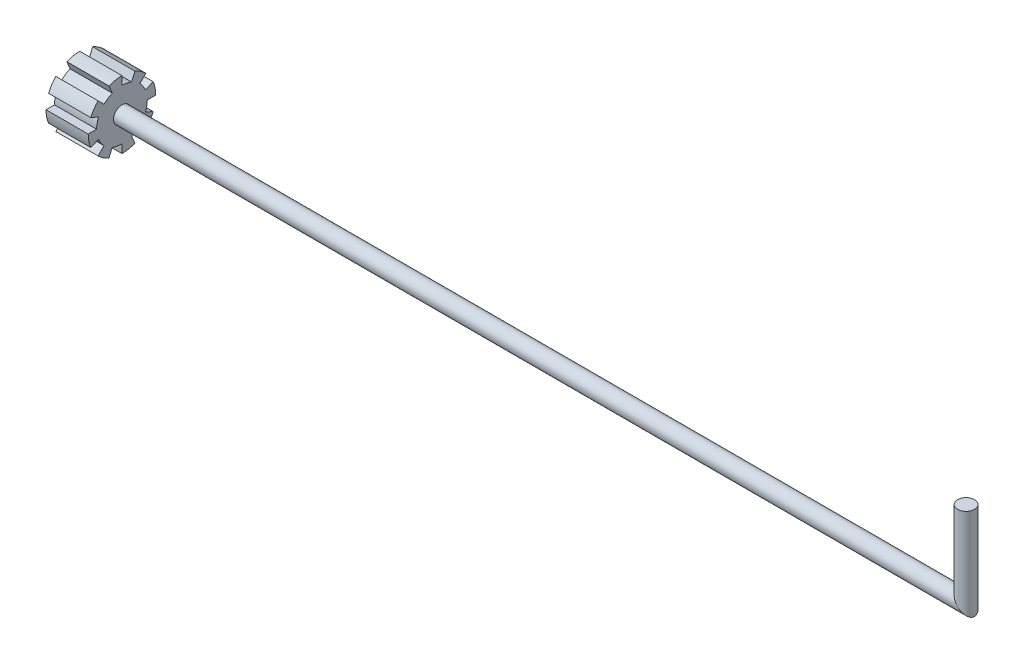
ISO-10303-21;
HEADER;
FILE_DESCRIPTION(('STEP AP214'),'2;1');
FILE_NAME('part.step','',(''),(''),'','','');
FILE_SCHEMA(('AUTOMOTIVE_DESIGN { 1 0 10303 214 1 1 1 1 }'));
ENDSEC;
DATA;
#1=APPLICATION_CONTEXT('core data for automotive mechanical design processes');
#2=APPLICATION_PROTOCOL_DEFINITION('international standard','automotive_design',2000,#1);
#3=PRODUCT_CONTEXT('',#1,'mechanical');
#4=PRODUCT('Part','Part','',(#3));
#5=PRODUCT_RELATED_PRODUCT_CATEGORY('part','',(#4));
#6=PRODUCT_DEFINITION_FORMATION('','',#4);
#7=PRODUCT_DEFINITION_CONTEXT('part definition',#1,'design');
#8=PRODUCT_DEFINITION('design','',#6,#7);
#9=PRODUCT_DEFINITION_SHAPE('','',#8);
#10=(LENGTH_UNIT() NAMED_UNIT(*) SI_UNIT(.MILLI.,.METRE.));
#11=(NAMED_UNIT(*) PLANE_ANGLE_UNIT() SI_UNIT($,.RADIAN.));
#12=(NAMED_UNIT(*) SI_UNIT($,.STERADIAN.) SOLID_ANGLE_UNIT());
#13=UNCERTAINTY_MEASURE_WITH_UNIT(LENGTH_MEASURE(1.E-05),#10,'distance_accuracy_value','');
#14=(GEOMETRIC_REPRESENTATION_CONTEXT(3) GLOBAL_UNCERTAINTY_ASSIGNED_CONTEXT((#13)) GLOBAL_UNIT_ASSIGNED_CONTEXT((#10,
#11,#12)) REPRESENTATION_CONTEXT('',''));
#15=CARTESIAN_POINT('',(0.,0.,0.));
#16=DIRECTION('',(0.,0.,1.));
#17=DIRECTION('',(1.,0.,0.));
#18=AXIS2_PLACEMENT_3D('',#15,#16,#17);
#19=CARTESIAN_POINT('',(5.,0.,0.));
#20=DIRECTION('',(-1.,0.,0.));
#21=DIRECTION('',(0.,0.,1.));
#22=AXIS2_PLACEMENT_3D('',#19,#20,#21);
#23=CYLINDRICAL_SURFACE('',#22,4.);
#24=DIRECTION('',(-1.,0.,0.));
#25=VECTOR('',#24,1.);
#26=CARTESIAN_POINT('',(5.,3.69551813004515,1.53073372946036));
#27=LINE('',#26,#25);
#28=CARTESIAN_POINT('',(5.,3.69551813004515,1.53073372946036));
#29=VERTEX_POINT('',#28);
#30=CARTESIAN_POINT('',(0.,3.69551813004515,1.53073372946036));
#31=VERTEX_POINT('',#30);
#32=EDGE_CURVE('E399',#29,#31,#27,.T.);
#33=ORIENTED_EDGE('',*,*,#32,.F.);
#34=CARTESIAN_POINT('',(5.,0.,0.));
#35=DIRECTION('',(1.,0.,0.));
#36=DIRECTION('',(0.,0.,-1.));
#37=AXIS2_PLACEMENT_3D('',#34,#35,#36);
#38=CIRCLE('',#37,4.);
#39=CARTESIAN_POINT('',(5.,4.,0.));
#40=VERTEX_POINT('',#39);
#41=EDGE_CURVE('E541',#40,#29,#38,.T.);
#42=ORIENTED_EDGE('',*,*,#41,.F.);
#43=DIRECTION('',(-1.,0.,0.));
#44=VECTOR('',#43,1.);
#45=CARTESIAN_POINT('',(5.,4.,0.));
#46=LINE('',#45,#44);
#47=CARTESIAN_POINT('',(0.,4.,0.));
#48=VERTEX_POINT('',#47);
#49=EDGE_CURVE('E285',#40,#48,#46,.T.);
#50=ORIENTED_EDGE('',*,*,#49,.T.);
#51=CARTESIAN_POINT('',(0.,0.,0.));
#52=DIRECTION('',(1.,0.,0.));
#53=DIRECTION('',(0.,0.,-1.));
#54=AXIS2_PLACEMENT_3D('',#51,#52,#53);
#55=CIRCLE('',#54,4.);
#56=EDGE_CURVE('E295',#48,#31,#55,.T.);
#57=ORIENTED_EDGE('',*,*,#56,.T.);
#58=EDGE_LOOP('',(#33,#42,#50,#57));
#59=FACE_BOUND('',#58,.T.);
#60=ADVANCED_FACE('F37',(#59),#23,.T.);
#61=DIRECTION('',(-1.,0.,0.));
#62=VECTOR('',#61,1.);
#63=CARTESIAN_POINT('',(5.,2.82842712474619,2.82842712474619));
#64=LINE('',#63,#62);
#65=CARTESIAN_POINT('',(5.,2.82842712474619,2.82842712474619));
#66=VERTEX_POINT('',#65);
#67=CARTESIAN_POINT('',(0.,2.82842712474619,2.82842712474619));
#68=VERTEX_POINT('',#67);
#69=EDGE_CURVE('E401',#66,#68,#64,.T.);
#70=ORIENTED_EDGE('',*,*,#69,.T.);
#71=CARTESIAN_POINT('',(0.,1.53073372946036,3.69551813004515));
#72=VERTEX_POINT('',#71);
#73=EDGE_CURVE('E567',#68,#72,#55,.T.);
#74=ORIENTED_EDGE('',*,*,#73,.T.);
#75=DIRECTION('',(-1.,0.,0.));
#76=VECTOR('',#75,1.);
#77=CARTESIAN_POINT('',(5.,1.53073372946036,3.69551813004515));
#78=LINE('',#77,#76);
#79=CARTESIAN_POINT('',(5.,1.53073372946036,3.69551813004515));
#80=VERTEX_POINT('',#79);
#81=EDGE_CURVE('E427',#80,#72,#78,.T.);
#82=ORIENTED_EDGE('',*,*,#81,.F.);
#83=EDGE_CURVE('E539',#66,#80,#38,.T.);
#84=ORIENTED_EDGE('',*,*,#83,.F.);
#85=EDGE_LOOP('',(#70,#74,#82,#84));
#86=FACE_BOUND('',#85,.T.);
#87=ADVANCED_FACE('F508',(#86),#23,.T.);
#88=DIRECTION('',(-1.,0.,0.));
#89=VECTOR('',#88,1.);
#90=CARTESIAN_POINT('',(5.,2.82842712474619,-2.82842712474619));
#91=LINE('',#90,#89);
#92=CARTESIAN_POINT('',(5.,2.82842712474619,-2.82842712474619));
#93=VERTEX_POINT('',#92);
#94=CARTESIAN_POINT('',(0.,2.82842712474619,-2.82842712474619));
#95=VERTEX_POINT('',#94);
#96=EDGE_CURVE('E375',#93,#95,#91,.T.);
#97=ORIENTED_EDGE('',*,*,#96,.T.);
#98=CARTESIAN_POINT('',(0.,3.69551813004515,-1.53073372946036));
#99=VERTEX_POINT('',#98);
#100=EDGE_CURVE('E288',#95,#99,#55,.T.);
#101=ORIENTED_EDGE('',*,*,#100,.T.);
#102=DIRECTION('',(-1.,0.,0.));
#103=VECTOR('',#102,1.);
#104=CARTESIAN_POINT('',(5.,3.69551813004515,-1.53073372946036));
#105=LINE('',#104,#103);
#106=CARTESIAN_POINT('',(5.,3.69551813004515,-1.53073372946036));
#107=VERTEX_POINT('',#106);
#108=EDGE_CURVE('E312',#107,#99,#105,.T.);
#109=ORIENTED_EDGE('',*,*,#108,.F.);
#110=EDGE_CURVE('E284',#93,#107,#38,.T.);
#111=ORIENTED_EDGE('',*,*,#110,.F.);
#112=EDGE_LOOP('',(#97,#101,#109,#111));
#113=FACE_BOUND('',#112,.T.);
#114=ADVANCED_FACE('F513',(#113),#23,.T.);
#115=DIRECTION('',(-1.,0.,0.));
#116=VECTOR('',#115,1.);
#117=CARTESIAN_POINT('',(5.,1.53073372946036,-3.69551813004515));
#118=LINE('',#117,#116);
#119=CARTESIAN_POINT('',(5.,1.53073372946036,-3.69551813004515));
#120=VERTEX_POINT('',#119);
#121=CARTESIAN_POINT('',(0.,1.53073372946036,-3.69551813004515));
#122=VERTEX_POINT('',#121);
#123=EDGE_CURVE('E382',#120,#122,#118,.T.);
#124=ORIENTED_EDGE('',*,*,#123,.F.);
#125=CARTESIAN_POINT('',(5.,0.,-4.));
#126=VERTEX_POINT('',#125);
#127=EDGE_CURVE('E44',#126,#120,#38,.T.);
#128=ORIENTED_EDGE('',*,*,#127,.F.);
#129=DIRECTION('',(-1.,0.,0.));
#130=VECTOR('',#129,1.);
#131=CARTESIAN_POINT('',(5.,0.,-4.));
#132=LINE('',#131,#130);
#133=CARTESIAN_POINT('',(0.,0.,-4.));
#134=VERTEX_POINT('',#133);
#135=EDGE_CURVE('E354',#126,#134,#132,.T.);
#136=ORIENTED_EDGE('',*,*,#135,.T.);
#137=EDGE_CURVE('E281',#134,#122,#55,.T.);
#138=ORIENTED_EDGE('',*,*,#137,.T.);
#139=EDGE_LOOP('',(#124,#128,#136,#138));
#140=FACE_BOUND('',#139,.T.);
#141=ADVANCED_FACE('F848',(#140),#23,.T.);
#142=DIRECTION('',(-1.,0.,0.));
#143=VECTOR('',#142,1.);
#144=CARTESIAN_POINT('',(5.,-1.53073372946036,-3.69551813004515));
#145=LINE('',#144,#143);
#146=CARTESIAN_POINT('',(5.,-1.53073372946036,-3.69551813004515));
#147=VERTEX_POINT('',#146);
#148=CARTESIAN_POINT('',(0.,-1.53073372946036,-3.69551813004515));
#149=VERTEX_POINT('',#148);
#150=EDGE_CURVE('E59',#147,#149,#145,.T.);
#151=ORIENTED_EDGE('',*,*,#150,.F.);
#152=CARTESIAN_POINT('',(5.,-2.82842712474619,-2.82842712474619));
#153=VERTEX_POINT('',#152);
#154=EDGE_CURVE('E276',#153,#147,#38,.T.);
#155=ORIENTED_EDGE('',*,*,#154,.F.);
#156=DIRECTION('',(-1.,0.,0.));
#157=VECTOR('',#156,1.);
#158=CARTESIAN_POINT('',(5.,-2.82842712474619,-2.82842712474619));
#159=LINE('',#158,#157);
#160=CARTESIAN_POINT('',(0.,-2.82842712474619,-2.82842712474619));
#161=VERTEX_POINT('',#160);
#162=EDGE_CURVE('E332',#153,#161,#159,.T.);
#163=ORIENTED_EDGE('',*,*,#162,.T.);
#164=EDGE_CURVE('E289',#161,#149,#55,.T.);
#165=ORIENTED_EDGE('',*,*,#164,.T.);
#166=EDGE_LOOP('',(#151,#155,#163,#165));
#167=FACE_BOUND('',#166,.T.);
#168=ADVANCED_FACE('F841',(#167),#23,.T.);
#169=DIRECTION('',(-1.,0.,0.));
#170=VECTOR('',#169,1.);
#171=CARTESIAN_POINT('',(5.,-3.69551813004515,-1.53073372946036));
#172=LINE('',#171,#170);
#173=CARTESIAN_POINT('',(5.,-3.69551813004515,-1.53073372946036));
#174=VERTEX_POINT('',#173);
#175=CARTESIAN_POINT('',(0.,-3.69551813004515,-1.53073372946036));
#176=VERTEX_POINT('',#175);
#177=EDGE_CURVE('E274',#174,#176,#172,.T.);
#178=ORIENTED_EDGE('',*,*,#177,.F.);
#179=CARTESIAN_POINT('',(5.,-4.,0.));
#180=VERTEX_POINT('',#179);
#181=EDGE_CURVE('E267',#180,#174,#38,.T.);
#182=ORIENTED_EDGE('',*,*,#181,.F.);
#183=DIRECTION('',(-1.,0.,0.));
#184=VECTOR('',#183,1.);
#185=CARTESIAN_POINT('',(5.,-4.,0.));
#186=LINE('',#185,#184);
#187=CARTESIAN_POINT('',(0.,-4.,0.));
#188=VERTEX_POINT('',#187);
#189=EDGE_CURVE('E247',#180,#188,#186,.T.);
#190=ORIENTED_EDGE('',*,*,#189,.T.);
#191=EDGE_CURVE('E297',#188,#176,#55,.T.);
#192=ORIENTED_EDGE('',*,*,#191,.T.);
#193=EDGE_LOOP('',(#178,#182,#190,#192));
#194=FACE_BOUND('',#193,.T.);
#195=ADVANCED_FACE('F273',(#194),#23,.T.);
#196=DIRECTION('',(-1.,0.,0.));
#197=VECTOR('',#196,1.);
#198=CARTESIAN_POINT('',(5.,-3.69551813004515,1.53073372946036));
#199=LINE('',#198,#197);
#200=CARTESIAN_POINT('',(5.,-3.69551813004515,1.53073372946036));
#201=VERTEX_POINT('',#200);
#202=CARTESIAN_POINT('',(0.,-3.69551813004515,1.53073372946036));
#203=VERTEX_POINT('',#202);
#204=EDGE_CURVE('E471',#201,#203,#199,.T.);
#205=ORIENTED_EDGE('',*,*,#204,.F.);
#206=CARTESIAN_POINT('',(5.,-2.82842712474619,2.82842712474619));
#207=VERTEX_POINT('',#206);
#208=EDGE_CURVE('E275',#207,#201,#38,.T.);
#209=ORIENTED_EDGE('',*,*,#208,.F.);
#210=DIRECTION('',(-1.,0.,0.));
#211=VECTOR('',#210,1.);
#212=CARTESIAN_POINT('',(5.,-2.82842712474619,2.82842712474619));
#213=LINE('',#212,#211);
#214=CARTESIAN_POINT('',(0.,-2.82842712474619,2.82842712474619));
#215=VERTEX_POINT('',#214);
#216=EDGE_CURVE('E445',#207,#215,#213,.T.);
#217=ORIENTED_EDGE('',*,*,#216,.T.);
#218=EDGE_CURVE('E301',#215,#203,#55,.T.);
#219=ORIENTED_EDGE('',*,*,#218,.T.);
#220=EDGE_LOOP('',(#205,#209,#217,#219));
#221=FACE_BOUND('',#220,.T.);
#222=ADVANCED_FACE('F517',(#221),#23,.T.);
#223=DIRECTION('',(-1.,0.,0.));
#224=VECTOR('',#223,1.);
#225=CARTESIAN_POINT('',(5.,-1.53073372946036,3.69551813004515));
#226=LINE('',#225,#224);
#227=CARTESIAN_POINT('',(5.,-1.53073372946036,3.69551813004515));
#228=VERTEX_POINT('',#227);
#229=CARTESIAN_POINT('',(0.,-1.53073372946036,3.69551813004515));
#230=VERTEX_POINT('',#229);
#231=EDGE_CURVE('E452',#228,#230,#226,.T.);
#232=ORIENTED_EDGE('',*,*,#231,.F.);
#233=CARTESIAN_POINT('',(5.,0.,4.));
#234=VERTEX_POINT('',#233);
#235=EDGE_CURVE('E279',#234,#228,#38,.T.);
#236=ORIENTED_EDGE('',*,*,#235,.F.);
#237=DIRECTION('',(-1.,0.,0.));
#238=VECTOR('',#237,1.);
#239=CARTESIAN_POINT('',(5.,0.,4.));
#240=LINE('',#239,#238);
#241=CARTESIAN_POINT('',(0.,0.,4.));
#242=VERTEX_POINT('',#241);
#243=EDGE_CURVE('E419',#234,#242,#240,.T.);
#244=ORIENTED_EDGE('',*,*,#243,.T.);
#245=EDGE_CURVE('E532',#242,#230,#55,.T.);
#246=ORIENTED_EDGE('',*,*,#245,.T.);
#247=EDGE_LOOP('',(#232,#236,#244,#246));
#248=FACE_BOUND('',#247,.T.);
#249=ADVANCED_FACE('F509',(#248),#23,.T.);
#250=CARTESIAN_POINT('',(5.,0.,0.));
#251=DIRECTION('',(1.,0.,0.));
#252=DIRECTION('',(0.,0.,-1.));
#253=AXIS2_PLACEMENT_3D('',#250,#251,#252);
#254=PLANE('',#253);
#255=CARTESIAN_POINT('',(5.,0.,0.));
#256=DIRECTION('',(1.,0.,0.));
#257=DIRECTION('',(0.,0.,-1.));
#258=AXIS2_PLACEMENT_3D('',#255,#256,#257);
#259=CIRCLE('',#258,1.);
#260=CARTESIAN_POINT('',(5.,0.,-1.));
#261=VERTEX_POINT('',#260);
#262=EDGE_CURVE('E11',#261,#261,#259,.T.);
#263=ORIENTED_EDGE('',*,*,#262,.F.);
#264=EDGE_LOOP('',(#263));
#265=FACE_BOUND('',#264,.T.);
#266=ORIENTED_EDGE('',*,*,#41,.T.);
#267=DIRECTION('',(0.,0.923879532511286,0.38268343236509));
#268=VECTOR('',#267,1.);
#269=CARTESIAN_POINT('',(5.,2.77163859753386,1.14805029709527));
#270=LINE('',#269,#268);
#271=CARTESIAN_POINT('',(5.,2.77163859753386,1.14805029709527));
#272=VERTEX_POINT('',#271);
#273=EDGE_CURVE('E416',#272,#29,#270,.T.);
#274=ORIENTED_EDGE('',*,*,#273,.F.);
#275=CARTESIAN_POINT('',(5.,0.,0.));
#276=DIRECTION('',(-1.,0.,0.));
#277=DIRECTION('',(0.,0.,-1.));
#278=AXIS2_PLACEMENT_3D('',#275,#276,#277);
#279=CIRCLE('',#278,3.);
#280=CARTESIAN_POINT('',(5.,2.12132034355964,2.12132034355964));
#281=VERTEX_POINT('',#280);
#282=EDGE_CURVE('E410',#281,#272,#279,.T.);
#283=ORIENTED_EDGE('',*,*,#282,.F.);
#284=DIRECTION('',(0.,-0.707106781186547,-0.707106781186547));
#285=VECTOR('',#284,1.);
#286=CARTESIAN_POINT('',(5.,2.12132034355964,2.12132034355964));
#287=LINE('',#286,#285);
#288=EDGE_CURVE('E406',#66,#281,#287,.T.);
#289=ORIENTED_EDGE('',*,*,#288,.F.);
#290=ORIENTED_EDGE('',*,*,#83,.T.);
#291=DIRECTION('',(0.,0.38268343236509,0.923879532511287));
#292=VECTOR('',#291,1.);
#293=CARTESIAN_POINT('',(5.,1.14805029709527,2.77163859753386));
#294=LINE('',#293,#292);
#295=CARTESIAN_POINT('',(5.,1.14805029709527,2.77163859753386));
#296=VERTEX_POINT('',#295);
#297=EDGE_CURVE('E429',#296,#80,#294,.T.);
#298=ORIENTED_EDGE('',*,*,#297,.F.);
#299=CARTESIAN_POINT('',(5.,0.,0.));
#300=DIRECTION('',(-1.,0.,0.));
#301=DIRECTION('',(0.,0.,-1.));
#302=AXIS2_PLACEMENT_3D('',#299,#300,#301);
#303=CIRCLE('',#302,3.);
#304=CARTESIAN_POINT('',(5.,0.,3.));
#305=VERTEX_POINT('',#304);
#306=EDGE_CURVE('E442',#305,#296,#303,.T.);
#307=ORIENTED_EDGE('',*,*,#306,.F.);
#308=DIRECTION('',(0.,0.,-1.));
#309=VECTOR('',#308,1.);
#310=CARTESIAN_POINT('',(5.,0.,3.));
#311=LINE('',#310,#309);
#312=EDGE_CURVE('E433',#234,#305,#311,.T.);
#313=ORIENTED_EDGE('',*,*,#312,.F.);
#314=ORIENTED_EDGE('',*,*,#235,.T.);
#315=DIRECTION('',(0.,-0.38268343236509,0.923879532511287));
#316=VECTOR('',#315,1.);
#317=CARTESIAN_POINT('',(5.,-1.14805029709527,2.77163859753386));
#318=LINE('',#317,#316);
#319=CARTESIAN_POINT('',(5.,-1.14805029709527,2.77163859753386));
#320=VERTEX_POINT('',#319);
#321=EDGE_CURVE('E454',#320,#228,#318,.T.);
#322=ORIENTED_EDGE('',*,*,#321,.F.);
#323=CARTESIAN_POINT('',(5.,0.,0.));
#324=DIRECTION('',(-1.,0.,0.));
#325=DIRECTION('',(0.,0.,-1.));
#326=AXIS2_PLACEMENT_3D('',#323,#324,#325);
#327=CIRCLE('',#326,3.);
#328=CARTESIAN_POINT('',(5.,-2.12132034355964,2.12132034355964));
#329=VERTEX_POINT('',#328);
#330=EDGE_CURVE('E465',#329,#320,#327,.T.);
#331=ORIENTED_EDGE('',*,*,#330,.F.);
#332=DIRECTION('',(0.,0.707106781186548,-0.707106781186547));
#333=VECTOR('',#332,1.);
#334=CARTESIAN_POINT('',(5.,-2.12132034355964,2.12132034355964));
#335=LINE('',#334,#333);
#336=EDGE_CURVE('E458',#207,#329,#335,.T.);
#337=ORIENTED_EDGE('',*,*,#336,.F.);
#338=ORIENTED_EDGE('',*,*,#208,.T.);
#339=DIRECTION('',(0.,-0.923879532511287,0.38268343236509));
#340=VECTOR('',#339,1.);
#341=CARTESIAN_POINT('',(5.,-2.77163859753386,1.14805029709527));
#342=LINE('',#341,#340);
#343=CARTESIAN_POINT('',(5.,-2.77163859753386,1.14805029709527));
#344=VERTEX_POINT('',#343);
#345=EDGE_CURVE('E473',#344,#201,#342,.T.);
#346=ORIENTED_EDGE('',*,*,#345,.F.);
#347=CARTESIAN_POINT('',(5.,0.,0.));
#348=DIRECTION('',(-1.,0.,0.));
#349=DIRECTION('',(0.,0.,-1.));
#350=AXIS2_PLACEMENT_3D('',#347,#348,#349);
#351=CIRCLE('',#350,3.);
#352=CARTESIAN_POINT('',(5.,-3.,0.));
#353=VERTEX_POINT('',#352);
#354=EDGE_CURVE('E269',#353,#344,#351,.T.);
#355=ORIENTED_EDGE('',*,*,#354,.F.);
#356=DIRECTION('',(0.,1.,0.));
#357=VECTOR('',#356,1.);
#358=CARTESIAN_POINT('',(5.,-3.,0.));
#359=LINE('',#358,#357);
#360=EDGE_CURVE('E250',#180,#353,#359,.T.);
#361=ORIENTED_EDGE('',*,*,#360,.F.);
#362=ORIENTED_EDGE('',*,*,#181,.T.);
#363=DIRECTION('',(0.,-0.923879532511287,-0.38268343236509));
#364=VECTOR('',#363,1.);
#365=CARTESIAN_POINT('',(5.,-2.77163859753386,-1.14805029709527));
#366=LINE('',#365,#364);
#367=CARTESIAN_POINT('',(5.,-2.77163859753386,-1.14805029709527));
#368=VERTEX_POINT('',#367);
#369=EDGE_CURVE('E340',#368,#174,#366,.T.);
#370=ORIENTED_EDGE('',*,*,#369,.F.);
#371=CARTESIAN_POINT('',(5.,0.,0.));
#372=DIRECTION('',(-1.,0.,0.));
#373=DIRECTION('',(0.,0.,-1.));
#374=AXIS2_PLACEMENT_3D('',#371,#372,#373);
#375=CIRCLE('',#374,3.);
#376=CARTESIAN_POINT('',(5.,-2.12132034355964,-2.12132034355964));
#377=VERTEX_POINT('',#376);
#378=EDGE_CURVE('E351',#377,#368,#375,.T.);
#379=ORIENTED_EDGE('',*,*,#378,.F.);
#380=DIRECTION('',(0.,0.707106781186547,0.707106781186548));
#381=VECTOR('',#380,1.);
#382=CARTESIAN_POINT('',(5.,-2.12132034355964,-2.12132034355964));
#383=LINE('',#382,#381);
#384=EDGE_CURVE('E344',#153,#377,#383,.T.);
#385=ORIENTED_EDGE('',*,*,#384,.F.);
#386=ORIENTED_EDGE('',*,*,#154,.T.);
#387=DIRECTION('',(0.,-0.38268343236509,-0.923879532511287));
#388=VECTOR('',#387,1.);
#389=CARTESIAN_POINT('',(5.,-1.14805029709527,-2.77163859753386));
#390=LINE('',#389,#388);
#391=CARTESIAN_POINT('',(5.,-1.14805029709527,-2.77163859753386));
#392=VERTEX_POINT('',#391);
#393=EDGE_CURVE('E362',#392,#147,#390,.T.);
#394=ORIENTED_EDGE('',*,*,#393,.F.);
#395=CARTESIAN_POINT('',(5.,0.,0.));
#396=DIRECTION('',(-1.,0.,0.));
#397=DIRECTION('',(0.,0.,-1.));
#398=AXIS2_PLACEMENT_3D('',#395,#396,#397);
#399=CIRCLE('',#398,3.);
#400=CARTESIAN_POINT('',(5.,0.,-3.));
#401=VERTEX_POINT('',#400);
#402=EDGE_CURVE('E372',#401,#392,#399,.T.);
#403=ORIENTED_EDGE('',*,*,#402,.F.);
#404=DIRECTION('',(0.,0.,1.));
#405=VECTOR('',#404,1.);
#406=CARTESIAN_POINT('',(5.,0.,-3.));
#407=LINE('',#406,#405);
#408=EDGE_CURVE('E365',#126,#401,#407,.T.);
#409=ORIENTED_EDGE('',*,*,#408,.F.);
#410=ORIENTED_EDGE('',*,*,#127,.T.);
#411=DIRECTION('',(0.,0.38268343236509,-0.923879532511287));
#412=VECTOR('',#411,1.);
#413=CARTESIAN_POINT('',(5.,1.14805029709527,-2.77163859753386));
#414=LINE('',#413,#412);
#415=CARTESIAN_POINT('',(5.,1.14805029709527,-2.77163859753386));
#416=VERTEX_POINT('',#415);
#417=EDGE_CURVE('E384',#416,#120,#414,.T.);
#418=ORIENTED_EDGE('',*,*,#417,.F.);
#419=CARTESIAN_POINT('',(5.,0.,0.));
#420=DIRECTION('',(-1.,0.,0.));
#421=DIRECTION('',(0.,0.,-1.));
#422=AXIS2_PLACEMENT_3D('',#419,#420,#421);
#423=CIRCLE('',#422,3.);
#424=CARTESIAN_POINT('',(5.,2.12132034355964,-2.12132034355964));
#425=VERTEX_POINT('',#424);
#426=EDGE_CURVE('E395',#425,#416,#423,.T.);
#427=ORIENTED_EDGE('',*,*,#426,.F.);
#428=DIRECTION('',(0.,-0.707106781186547,0.707106781186547));
#429=VECTOR('',#428,1.);
#430=CARTESIAN_POINT('',(5.,2.12132034355964,-2.12132034355964));
#431=LINE('',#430,#429);
#432=EDGE_CURVE('E388',#93,#425,#431,.T.);
#433=ORIENTED_EDGE('',*,*,#432,.F.);
#434=ORIENTED_EDGE('',*,*,#110,.T.);
#435=DIRECTION('',(0.,0.923879532511287,-0.38268343236509));
#436=VECTOR('',#435,1.);
#437=CARTESIAN_POINT('',(5.,2.77163859753386,-1.14805029709527));
#438=LINE('',#437,#436);
#439=CARTESIAN_POINT('',(5.,2.77163859753386,-1.14805029709527));
#440=VERTEX_POINT('',#439);
#441=EDGE_CURVE('E316',#440,#107,#438,.T.);
#442=ORIENTED_EDGE('',*,*,#441,.F.);
#443=CARTESIAN_POINT('',(5.,0.,0.));
#444=DIRECTION('',(-1.,0.,0.));
#445=DIRECTION('',(0.,0.,-1.));
#446=AXIS2_PLACEMENT_3D('',#443,#444,#445);
#447=CIRCLE('',#446,3.);
#448=CARTESIAN_POINT('',(5.,3.,0.));
#449=VERTEX_POINT('',#448);
#450=EDGE_CURVE('E329',#449,#440,#447,.T.);
#451=ORIENTED_EDGE('',*,*,#450,.F.);
#452=DIRECTION('',(0.,-1.,0.));
#453=VECTOR('',#452,1.);
#454=CARTESIAN_POINT('',(5.,3.,0.));
#455=LINE('',#454,#453);
#456=EDGE_CURVE('E320',#40,#449,#455,.T.);
#457=ORIENTED_EDGE('',*,*,#456,.F.);
#458=EDGE_LOOP('',(#266,#274,#283,#289,#290,#298,#307,#313,#314,#322,#331,#337,#338,#346,#355,
#361,#362,#370,#379,#385,#386,#394,#403,#409,#410,#418,#427,#433,#434,#442,#451,#457));
#459=FACE_BOUND('',#458,.T.);
#460=ADVANCED_FACE('F265',(#265,#459),#254,.T.);
#461=CARTESIAN_POINT('',(0.,0.,0.));
#462=DIRECTION('',(1.,0.,0.));
#463=DIRECTION('',(0.,0.,-1.));
#464=AXIS2_PLACEMENT_3D('',#461,#462,#463);
#465=PLANE('',#464);
#466=DIRECTION('',(0.,0.923879532511286,0.38268343236509));
#467=VECTOR('',#466,1.);
#468=CARTESIAN_POINT('',(0.,2.77163859753386,1.14805029709527));
#469=LINE('',#468,#467);
#470=CARTESIAN_POINT('',(0.,2.77163859753386,1.14805029709527));
#471=VERTEX_POINT('',#470);
#472=EDGE_CURVE('E411',#471,#31,#469,.T.);
#473=ORIENTED_EDGE('',*,*,#472,.T.);
#474=ORIENTED_EDGE('',*,*,#56,.F.);
#475=DIRECTION('',(0.,-1.,0.));
#476=VECTOR('',#475,1.);
#477=CARTESIAN_POINT('',(0.,3.,0.));
#478=LINE('',#477,#476);
#479=CARTESIAN_POINT('',(0.,3.,0.));
#480=VERTEX_POINT('',#479);
#481=EDGE_CURVE('E324',#48,#480,#478,.T.);
#482=ORIENTED_EDGE('',*,*,#481,.T.);
#483=CARTESIAN_POINT('',(0.,0.,0.));
#484=DIRECTION('',(-1.,0.,0.));
#485=DIRECTION('',(0.,0.,-1.));
#486=AXIS2_PLACEMENT_3D('',#483,#484,#485);
#487=CIRCLE('',#486,3.);
#488=CARTESIAN_POINT('',(0.,2.77163859753386,-1.14805029709527));
#489=VERTEX_POINT('',#488);
#490=EDGE_CURVE('E321',#480,#489,#487,.T.);
#491=ORIENTED_EDGE('',*,*,#490,.T.);
#492=DIRECTION('',(0.,0.923879532511287,-0.38268343236509));
#493=VECTOR('',#492,1.);
#494=CARTESIAN_POINT('',(0.,2.77163859753386,-1.14805029709527));
#495=LINE('',#494,#493);
#496=EDGE_CURVE('E317',#489,#99,#495,.T.);
#497=ORIENTED_EDGE('',*,*,#496,.T.);
#498=ORIENTED_EDGE('',*,*,#100,.F.);
#499=DIRECTION('',(0.,-0.707106781186547,0.707106781186547));
#500=VECTOR('',#499,1.);
#501=CARTESIAN_POINT('',(0.,2.12132034355964,-2.12132034355964));
#502=LINE('',#501,#500);
#503=CARTESIAN_POINT('',(0.,2.12132034355964,-2.12132034355964));
#504=VERTEX_POINT('',#503);
#505=EDGE_CURVE('E356',#95,#504,#502,.T.);
#506=ORIENTED_EDGE('',*,*,#505,.T.);
#507=CARTESIAN_POINT('',(0.,0.,0.));
#508=DIRECTION('',(-1.,0.,0.));
#509=DIRECTION('',(0.,0.,-1.));
#510=AXIS2_PLACEMENT_3D('',#507,#508,#509);
#511=CIRCLE('',#510,3.);
#512=CARTESIAN_POINT('',(0.,1.14805029709527,-2.77163859753386));
#513=VERTEX_POINT('',#512);
#514=EDGE_CURVE('E389',#504,#513,#511,.T.);
#515=ORIENTED_EDGE('',*,*,#514,.T.);
#516=DIRECTION('',(0.,0.38268343236509,-0.923879532511287));
#517=VECTOR('',#516,1.);
#518=CARTESIAN_POINT('',(0.,1.14805029709527,-2.77163859753386));
#519=LINE('',#518,#517);
#520=EDGE_CURVE('E385',#513,#122,#519,.T.);
#521=ORIENTED_EDGE('',*,*,#520,.T.);
#522=ORIENTED_EDGE('',*,*,#137,.F.);
#523=DIRECTION('',(0.,0.,1.));
#524=VECTOR('',#523,1.);
#525=CARTESIAN_POINT('',(0.,0.,-3.));
#526=LINE('',#525,#524);
#527=CARTESIAN_POINT('',(0.,0.,-3.));
#528=VERTEX_POINT('',#527);
#529=EDGE_CURVE('E334',#134,#528,#526,.T.);
#530=ORIENTED_EDGE('',*,*,#529,.T.);
#531=CARTESIAN_POINT('',(0.,0.,0.));
#532=DIRECTION('',(-1.,0.,0.));
#533=DIRECTION('',(0.,0.,-1.));
#534=AXIS2_PLACEMENT_3D('',#531,#532,#533);
#535=CIRCLE('',#534,3.);
#536=CARTESIAN_POINT('',(0.,-1.14805029709527,-2.77163859753386));
#537=VERTEX_POINT('',#536);
#538=EDGE_CURVE('E366',#528,#537,#535,.T.);
#539=ORIENTED_EDGE('',*,*,#538,.T.);
#540=DIRECTION('',(0.,-0.38268343236509,-0.923879532511287));
#541=VECTOR('',#540,1.);
#542=CARTESIAN_POINT('',(0.,-1.14805029709527,-2.77163859753386));
#543=LINE('',#542,#541);
#544=EDGE_CURVE('E363',#537,#149,#543,.T.);
#545=ORIENTED_EDGE('',*,*,#544,.T.);
#546=ORIENTED_EDGE('',*,*,#164,.F.);
#547=DIRECTION('',(0.,0.707106781186547,0.707106781186548));
#548=VECTOR('',#547,1.);
#549=CARTESIAN_POINT('',(0.,-2.12132034355964,-2.12132034355964));
#550=LINE('',#549,#548);
#551=CARTESIAN_POINT('',(0.,-2.12132034355964,-2.12132034355964));
#552=VERTEX_POINT('',#551);
#553=EDGE_CURVE('E258',#161,#552,#550,.T.);
#554=ORIENTED_EDGE('',*,*,#553,.T.);
#555=CARTESIAN_POINT('',(0.,0.,0.));
#556=DIRECTION('',(-1.,0.,0.));
#557=DIRECTION('',(0.,0.,-1.));
#558=AXIS2_PLACEMENT_3D('',#555,#556,#557);
#559=CIRCLE('',#558,3.);
#560=CARTESIAN_POINT('',(0.,-2.77163859753386,-1.14805029709527));
#561=VERTEX_POINT('',#560);
#562=EDGE_CURVE('E345',#552,#561,#559,.T.);
#563=ORIENTED_EDGE('',*,*,#562,.T.);
#564=DIRECTION('',(0.,-0.923879532511287,-0.38268343236509));
#565=VECTOR('',#564,1.);
#566=CARTESIAN_POINT('',(0.,-2.77163859753386,-1.14805029709527));
#567=LINE('',#566,#565);
#568=EDGE_CURVE('E341',#561,#176,#567,.T.);
#569=ORIENTED_EDGE('',*,*,#568,.T.);
#570=ORIENTED_EDGE('',*,*,#191,.F.);
#571=DIRECTION('',(0.,1.,0.));
#572=VECTOR('',#571,1.);
#573=CARTESIAN_POINT('',(0.,-3.,0.));
#574=LINE('',#573,#572);
#575=CARTESIAN_POINT('',(0.,-3.,0.));
#576=VERTEX_POINT('',#575);
#577=EDGE_CURVE('E253',#188,#576,#574,.T.);
#578=ORIENTED_EDGE('',*,*,#577,.T.);
#579=CARTESIAN_POINT('',(0.,0.,0.));
#580=DIRECTION('',(-1.,0.,0.));
#581=DIRECTION('',(0.,0.,-1.));
#582=AXIS2_PLACEMENT_3D('',#579,#580,#581);
#583=CIRCLE('',#582,3.);
#584=CARTESIAN_POINT('',(0.,-2.77163859753386,1.14805029709527));
#585=VERTEX_POINT('',#584);
#586=EDGE_CURVE('E476',#576,#585,#583,.T.);
#587=ORIENTED_EDGE('',*,*,#586,.T.);
#588=DIRECTION('',(0.,-0.923879532511287,0.38268343236509));
#589=VECTOR('',#588,1.);
#590=CARTESIAN_POINT('',(0.,-2.77163859753386,1.14805029709527));
#591=LINE('',#590,#589);
#592=EDGE_CURVE('E270',#585,#203,#591,.T.);
#593=ORIENTED_EDGE('',*,*,#592,.T.);
#594=ORIENTED_EDGE('',*,*,#218,.F.);
#595=DIRECTION('',(0.,0.707106781186548,-0.707106781186547));
#596=VECTOR('',#595,1.);
#597=CARTESIAN_POINT('',(0.,-2.12132034355964,2.12132034355964));
#598=LINE('',#597,#596);
#599=CARTESIAN_POINT('',(0.,-2.12132034355964,2.12132034355964));
#600=VERTEX_POINT('',#599);
#601=EDGE_CURVE('E422',#215,#600,#598,.T.);
#602=ORIENTED_EDGE('',*,*,#601,.T.);
#603=CARTESIAN_POINT('',(0.,0.,0.));
#604=DIRECTION('',(-1.,0.,0.));
#605=DIRECTION('',(0.,0.,-1.));
#606=AXIS2_PLACEMENT_3D('',#603,#604,#605);
#607=CIRCLE('',#606,3.);
#608=CARTESIAN_POINT('',(0.,-1.14805029709527,2.77163859753386));
#609=VERTEX_POINT('',#608);
#610=EDGE_CURVE('E459',#600,#609,#607,.T.);
#611=ORIENTED_EDGE('',*,*,#610,.T.);
#612=DIRECTION('',(0.,-0.38268343236509,0.923879532511287));
#613=VECTOR('',#612,1.);
#614=CARTESIAN_POINT('',(0.,-1.14805029709527,2.77163859753386));
#615=LINE('',#614,#613);
#616=EDGE_CURVE('E455',#609,#230,#615,.T.);
#617=ORIENTED_EDGE('',*,*,#616,.T.);
#618=ORIENTED_EDGE('',*,*,#245,.F.);
#619=DIRECTION('',(0.,0.,-1.));
#620=VECTOR('',#619,1.);
#621=CARTESIAN_POINT('',(0.,0.,3.));
#622=LINE('',#621,#620);
#623=CARTESIAN_POINT('',(0.,0.,3.));
#624=VERTEX_POINT('',#623);
#625=EDGE_CURVE('E437',#242,#624,#622,.T.);
#626=ORIENTED_EDGE('',*,*,#625,.T.);
#627=CARTESIAN_POINT('',(0.,0.,0.));
#628=DIRECTION('',(-1.,0.,0.));
#629=DIRECTION('',(0.,0.,-1.));
#630=AXIS2_PLACEMENT_3D('',#627,#628,#629);
#631=CIRCLE('',#630,3.);
#632=CARTESIAN_POINT('',(0.,1.14805029709527,2.77163859753386));
#633=VERTEX_POINT('',#632);
#634=EDGE_CURVE('E434',#624,#633,#631,.T.);
#635=ORIENTED_EDGE('',*,*,#634,.T.);
#636=DIRECTION('',(0.,0.38268343236509,0.923879532511287));
#637=VECTOR('',#636,1.);
#638=CARTESIAN_POINT('',(0.,1.14805029709527,2.77163859753386));
#639=LINE('',#638,#637);
#640=EDGE_CURVE('E430',#633,#72,#639,.T.);
#641=ORIENTED_EDGE('',*,*,#640,.T.);
#642=ORIENTED_EDGE('',*,*,#73,.F.);
#643=DIRECTION('',(0.,-0.707106781186547,-0.707106781186547));
#644=VECTOR('',#643,1.);
#645=CARTESIAN_POINT('',(0.,2.12132034355964,2.12132034355964));
#646=LINE('',#645,#644);
#647=CARTESIAN_POINT('',(0.,2.12132034355964,2.12132034355964));
#648=VERTEX_POINT('',#647);
#649=EDGE_CURVE('E407',#68,#648,#646,.T.);
#650=ORIENTED_EDGE('',*,*,#649,.T.);
#651=CARTESIAN_POINT('',(0.,0.,0.));
#652=DIRECTION('',(-1.,0.,0.));
#653=DIRECTION('',(0.,0.,-1.));
#654=AXIS2_PLACEMENT_3D('',#651,#652,#653);
#655=CIRCLE('',#654,3.);
#656=EDGE_CURVE('E51',#648,#471,#655,.T.);
#657=ORIENTED_EDGE('',*,*,#656,.T.);
#658=EDGE_LOOP('',(#473,#474,#482,#491,#497,#498,#506,#515,#521,#522,#530,#539,#545,#546,#554,
#563,#569,#570,#578,#587,#593,#594,#602,#611,#617,#618,#626,#635,#641,#642,#650,#657));
#659=FACE_BOUND('',#658,.T.);
#660=ADVANCED_FACE('F523',(#659),#465,.F.);
#661=CARTESIAN_POINT('',(5.,3.,0.));
#662=DIRECTION('',(0.,0.,-1.));
#663=DIRECTION('',(-1.,0.,0.));
#664=AXIS2_PLACEMENT_3D('',#661,#662,#663);
#665=PLANE('',#664);
#666=ORIENTED_EDGE('',*,*,#481,.F.);
#667=ORIENTED_EDGE('',*,*,#49,.F.);
#668=ORIENTED_EDGE('',*,*,#456,.T.);
#669=DIRECTION('',(-1.,0.,0.));
#670=VECTOR('',#669,1.);
#671=CARTESIAN_POINT('',(5.,3.,0.));
#672=LINE('',#671,#670);
#673=EDGE_CURVE('E303',#449,#480,#672,.T.);
#674=ORIENTED_EDGE('',*,*,#673,.T.);
#675=EDGE_LOOP('',(#666,#667,#668,#674));
#676=FACE_BOUND('',#675,.T.);
#677=ADVANCED_FACE('F660',(#676),#665,.T.);
#678=CARTESIAN_POINT('',(5.,0.,0.));
#679=DIRECTION('',(-1.,0.,0.));
#680=DIRECTION('',(0.,0.,1.));
#681=AXIS2_PLACEMENT_3D('',#678,#679,#680);
#682=CYLINDRICAL_SURFACE('',#681,3.);
#683=ORIENTED_EDGE('',*,*,#490,.F.);
#684=ORIENTED_EDGE('',*,*,#673,.F.);
#685=ORIENTED_EDGE('',*,*,#450,.T.);
#686=DIRECTION('',(-1.,0.,0.));
#687=VECTOR('',#686,1.);
#688=CARTESIAN_POINT('',(5.,2.77163859753386,-1.14805029709527));
#689=LINE('',#688,#687);
#690=EDGE_CURVE('E308',#440,#489,#689,.T.);
#691=ORIENTED_EDGE('',*,*,#690,.T.);
#692=EDGE_LOOP('',(#683,#684,#685,#691));
#693=FACE_BOUND('',#692,.T.);
#694=ADVANCED_FACE('F562',(#693),#682,.T.);
#695=CARTESIAN_POINT('',(5.,2.77163859753386,-1.14805029709527));
#696=DIRECTION('',(0.,0.38268343236509,0.923879532511287));
#697=DIRECTION('',(0.,-0.923879532511287,0.38268343236509));
#698=AXIS2_PLACEMENT_3D('',#695,#696,#697);
#699=PLANE('',#698);
#700=ORIENTED_EDGE('',*,*,#496,.F.);
#701=ORIENTED_EDGE('',*,*,#690,.F.);
#702=ORIENTED_EDGE('',*,*,#441,.T.);
#703=ORIENTED_EDGE('',*,*,#108,.T.);
#704=EDGE_LOOP('',(#700,#701,#702,#703));
#705=FACE_BOUND('',#704,.T.);
#706=ADVANCED_FACE('F558',(#705),#699,.T.);
#707=CARTESIAN_POINT('',(5.,0.,3.));
#708=DIRECTION('',(0.,1.,0.));
#709=DIRECTION('',(0.,0.,1.));
#710=AXIS2_PLACEMENT_3D('',#707,#708,#709);
#711=PLANE('',#710);
#712=ORIENTED_EDGE('',*,*,#625,.F.);
#713=ORIENTED_EDGE('',*,*,#243,.F.);
#714=ORIENTED_EDGE('',*,*,#312,.T.);
#715=DIRECTION('',(-1.,0.,0.));
#716=VECTOR('',#715,1.);
#717=CARTESIAN_POINT('',(5.,0.,3.));
#718=LINE('',#717,#716);
#719=EDGE_CURVE('E423',#305,#624,#718,.T.);
#720=ORIENTED_EDGE('',*,*,#719,.T.);
#721=EDGE_LOOP('',(#712,#713,#714,#720));
#722=FACE_BOUND('',#721,.T.);
#723=ADVANCED_FACE('F578',(#722),#711,.T.);
#724=CARTESIAN_POINT('',(5.,0.,0.));
#725=DIRECTION('',(-1.,0.,0.));
#726=DIRECTION('',(0.,0.,1.));
#727=AXIS2_PLACEMENT_3D('',#724,#725,#726);
#728=CYLINDRICAL_SURFACE('',#727,3.);
#729=ORIENTED_EDGE('',*,*,#634,.F.);
#730=ORIENTED_EDGE('',*,*,#719,.F.);
#731=ORIENTED_EDGE('',*,*,#306,.T.);
#732=DIRECTION('',(-1.,0.,0.));
#733=VECTOR('',#732,1.);
#734=CARTESIAN_POINT('',(5.,1.14805029709527,2.77163859753386));
#735=LINE('',#734,#733);
#736=EDGE_CURVE('E425',#296,#633,#735,.T.);
#737=ORIENTED_EDGE('',*,*,#736,.T.);
#738=EDGE_LOOP('',(#729,#730,#731,#737));
#739=FACE_BOUND('',#738,.T.);
#740=ADVANCED_FACE('F576',(#739),#728,.T.);
#741=CARTESIAN_POINT('',(5.,1.14805029709527,2.77163859753386));
#742=DIRECTION('',(0.,-0.923879532511287,0.38268343236509));
#743=DIRECTION('',(0.,-0.38268343236509,-0.923879532511287));
#744=AXIS2_PLACEMENT_3D('',#741,#742,#743);
#745=PLANE('',#744);
#746=ORIENTED_EDGE('',*,*,#640,.F.);
#747=ORIENTED_EDGE('',*,*,#736,.F.);
#748=ORIENTED_EDGE('',*,*,#297,.T.);
#749=ORIENTED_EDGE('',*,*,#81,.T.);
#750=EDGE_LOOP('',(#746,#747,#748,#749));
#751=FACE_BOUND('',#750,.T.);
#752=ADVANCED_FACE('F571',(#751),#745,.T.);
#753=CARTESIAN_POINT('',(5.,-2.12132034355964,2.12132034355964));
#754=DIRECTION('',(0.,0.707106781186547,0.707106781186548));
#755=DIRECTION('',(0.,-0.707106781186548,0.707106781186547));
#756=AXIS2_PLACEMENT_3D('',#753,#754,#755);
#757=PLANE('',#756);
#758=ORIENTED_EDGE('',*,*,#601,.F.);
#759=ORIENTED_EDGE('',*,*,#216,.F.);
#760=ORIENTED_EDGE('',*,*,#336,.T.);
#761=DIRECTION('',(-1.,0.,0.));
#762=VECTOR('',#761,1.);
#763=CARTESIAN_POINT('',(5.,-2.12132034355964,2.12132034355964));
#764=LINE('',#763,#762);
#765=EDGE_CURVE('E448',#329,#600,#764,.T.);
#766=ORIENTED_EDGE('',*,*,#765,.T.);
#767=EDGE_LOOP('',(#758,#759,#760,#766));
#768=FACE_BOUND('',#767,.T.);
#769=ADVANCED_FACE('F591',(#768),#757,.T.);
#770=CARTESIAN_POINT('',(5.,0.,0.));
#771=DIRECTION('',(-1.,0.,0.));
#772=DIRECTION('',(0.,0.,1.));
#773=AXIS2_PLACEMENT_3D('',#770,#771,#772);
#774=CYLINDRICAL_SURFACE('',#773,3.);
#775=ORIENTED_EDGE('',*,*,#610,.F.);
#776=ORIENTED_EDGE('',*,*,#765,.F.);
#777=ORIENTED_EDGE('',*,*,#330,.T.);
#778=DIRECTION('',(-1.,0.,0.));
#779=VECTOR('',#778,1.);
#780=CARTESIAN_POINT('',(5.,-1.14805029709527,2.77163859753386));
#781=LINE('',#780,#779);
#782=EDGE_CURVE('E450',#320,#609,#781,.T.);
#783=ORIENTED_EDGE('',*,*,#782,.T.);
#784=EDGE_LOOP('',(#775,#776,#777,#783));
#785=FACE_BOUND('',#784,.T.);
#786=ADVANCED_FACE('F594',(#785),#774,.T.);
#787=CARTESIAN_POINT('',(5.,-1.14805029709527,2.77163859753386));
#788=DIRECTION('',(0.,-0.923879532511287,-0.38268343236509));
#789=DIRECTION('',(0.,0.38268343236509,-0.923879532511287));
#790=AXIS2_PLACEMENT_3D('',#787,#788,#789);
#791=PLANE('',#790);
#792=ORIENTED_EDGE('',*,*,#616,.F.);
#793=ORIENTED_EDGE('',*,*,#782,.F.);
#794=ORIENTED_EDGE('',*,*,#321,.T.);
#795=ORIENTED_EDGE('',*,*,#231,.T.);
#796=EDGE_LOOP('',(#792,#793,#794,#795));
#797=FACE_BOUND('',#796,.T.);
#798=ADVANCED_FACE('F596',(#797),#791,.T.);
#799=CARTESIAN_POINT('',(5.,-3.,0.));
#800=DIRECTION('',(0.,0.,1.));
#801=DIRECTION('',(0.,-1.,0.));
#802=AXIS2_PLACEMENT_3D('',#799,#800,#801);
#803=PLANE('',#802);
#804=ORIENTED_EDGE('',*,*,#577,.F.);
#805=ORIENTED_EDGE('',*,*,#189,.F.);
#806=ORIENTED_EDGE('',*,*,#360,.T.);
#807=DIRECTION('',(-1.,0.,0.));
#808=VECTOR('',#807,1.);
#809=CARTESIAN_POINT('',(5.,-3.,0.));
#810=LINE('',#809,#808);
#811=EDGE_CURVE('E259',#353,#576,#810,.T.);
#812=ORIENTED_EDGE('',*,*,#811,.T.);
#813=EDGE_LOOP('',(#804,#805,#806,#812));
#814=FACE_BOUND('',#813,.T.);
#815=ADVANCED_FACE('F249',(#814),#803,.T.);
#816=CARTESIAN_POINT('',(5.,0.,0.));
#817=DIRECTION('',(-1.,0.,0.));
#818=DIRECTION('',(0.,0.,1.));
#819=AXIS2_PLACEMENT_3D('',#816,#817,#818);
#820=CYLINDRICAL_SURFACE('',#819,3.);
#821=ORIENTED_EDGE('',*,*,#586,.F.);
#822=ORIENTED_EDGE('',*,*,#811,.F.);
#823=ORIENTED_EDGE('',*,*,#354,.T.);
#824=DIRECTION('',(-1.,0.,0.));
#825=VECTOR('',#824,1.);
#826=CARTESIAN_POINT('',(5.,-2.77163859753386,1.14805029709527));
#827=LINE('',#826,#825);
#828=EDGE_CURVE('E469',#344,#585,#827,.T.);
#829=ORIENTED_EDGE('',*,*,#828,.T.);
#830=EDGE_LOOP('',(#821,#822,#823,#829));
#831=FACE_BOUND('',#830,.T.);
#832=ADVANCED_FACE('F603',(#831),#820,.T.);
#833=CARTESIAN_POINT('',(5.,-2.77163859753386,1.14805029709527));
#834=DIRECTION('',(0.,-0.38268343236509,-0.923879532511287));
#835=DIRECTION('',(0.,0.923879532511287,-0.38268343236509));
#836=AXIS2_PLACEMENT_3D('',#833,#834,#835);
#837=PLANE('',#836);
#838=ORIENTED_EDGE('',*,*,#592,.F.);
#839=ORIENTED_EDGE('',*,*,#828,.F.);
#840=ORIENTED_EDGE('',*,*,#345,.T.);
#841=ORIENTED_EDGE('',*,*,#204,.T.);
#842=EDGE_LOOP('',(#838,#839,#840,#841));
#843=FACE_BOUND('',#842,.T.);
#844=ADVANCED_FACE('F587',(#843),#837,.T.);
#845=CARTESIAN_POINT('',(5.,-2.12132034355964,-2.12132034355964));
#846=DIRECTION('',(0.,-0.707106781186548,0.707106781186547));
#847=DIRECTION('',(0.,-0.707106781186547,-0.707106781186548));
#848=AXIS2_PLACEMENT_3D('',#845,#846,#847);
#849=PLANE('',#848);
#850=ORIENTED_EDGE('',*,*,#553,.F.);
#851=ORIENTED_EDGE('',*,*,#162,.F.);
#852=ORIENTED_EDGE('',*,*,#384,.T.);
#853=DIRECTION('',(-1.,0.,0.));
#854=VECTOR('',#853,1.);
#855=CARTESIAN_POINT('',(5.,-2.12132034355964,-2.12132034355964));
#856=LINE('',#855,#854);
#857=EDGE_CURVE('E335',#377,#552,#856,.T.);
#858=ORIENTED_EDGE('',*,*,#857,.T.);
#859=EDGE_LOOP('',(#850,#851,#852,#858));
#860=FACE_BOUND('',#859,.T.);
#861=ADVANCED_FACE('F651',(#860),#849,.T.);
#862=CARTESIAN_POINT('',(5.,0.,0.));
#863=DIRECTION('',(-1.,0.,0.));
#864=DIRECTION('',(0.,0.,1.));
#865=AXIS2_PLACEMENT_3D('',#862,#863,#864);
#866=CYLINDRICAL_SURFACE('',#865,3.);
#867=ORIENTED_EDGE('',*,*,#562,.F.);
#868=ORIENTED_EDGE('',*,*,#857,.F.);
#869=ORIENTED_EDGE('',*,*,#378,.T.);
#870=DIRECTION('',(-1.,0.,0.));
#871=VECTOR('',#870,1.);
#872=CARTESIAN_POINT('',(5.,-2.77163859753386,-1.14805029709527));
#873=LINE('',#872,#871);
#874=EDGE_CURVE('E337',#368,#561,#873,.T.);
#875=ORIENTED_EDGE('',*,*,#874,.T.);
#876=EDGE_LOOP('',(#867,#868,#869,#875));
#877=FACE_BOUND('',#876,.T.);
#878=ADVANCED_FACE('F647',(#877),#866,.T.);
#879=CARTESIAN_POINT('',(5.,-2.77163859753386,-1.14805029709527));
#880=DIRECTION('',(0.,0.38268343236509,-0.923879532511287));
#881=DIRECTION('',(0.,0.923879532511287,0.38268343236509));
#882=AXIS2_PLACEMENT_3D('',#879,#880,#881);
#883=PLANE('',#882);
#884=ORIENTED_EDGE('',*,*,#568,.F.);
#885=ORIENTED_EDGE('',*,*,#874,.F.);
#886=ORIENTED_EDGE('',*,*,#369,.T.);
#887=ORIENTED_EDGE('',*,*,#177,.T.);
#888=EDGE_LOOP('',(#884,#885,#886,#887));
#889=FACE_BOUND('',#888,.T.);
#890=ADVANCED_FACE('F643',(#889),#883,.T.);
#891=CARTESIAN_POINT('',(5.,0.,-3.));
#892=DIRECTION('',(0.,-1.,0.));
#893=DIRECTION('',(0.,0.,-1.));
#894=AXIS2_PLACEMENT_3D('',#891,#892,#893);
#895=PLANE('',#894);
#896=ORIENTED_EDGE('',*,*,#529,.F.);
#897=ORIENTED_EDGE('',*,*,#135,.F.);
#898=ORIENTED_EDGE('',*,*,#408,.T.);
#899=DIRECTION('',(-1.,0.,0.));
#900=VECTOR('',#899,1.);
#901=CARTESIAN_POINT('',(5.,0.,-3.));
#902=LINE('',#901,#900);
#903=EDGE_CURVE('E357',#401,#528,#902,.T.);
#904=ORIENTED_EDGE('',*,*,#903,.T.);
#905=EDGE_LOOP('',(#896,#897,#898,#904));
#906=FACE_BOUND('',#905,.T.);
#907=ADVANCED_FACE('F639',(#906),#895,.T.);
#908=CARTESIAN_POINT('',(5.,0.,0.));
#909=DIRECTION('',(-1.,0.,0.));
#910=DIRECTION('',(0.,0.,1.));
#911=AXIS2_PLACEMENT_3D('',#908,#909,#910);
#912=CYLINDRICAL_SURFACE('',#911,3.);
#913=ORIENTED_EDGE('',*,*,#538,.F.);
#914=ORIENTED_EDGE('',*,*,#903,.F.);
#915=ORIENTED_EDGE('',*,*,#402,.T.);
#916=DIRECTION('',(-1.,0.,0.));
#917=VECTOR('',#916,1.);
#918=CARTESIAN_POINT('',(5.,-1.14805029709527,-2.77163859753386));
#919=LINE('',#918,#917);
#920=EDGE_CURVE('E359',#392,#537,#919,.T.);
#921=ORIENTED_EDGE('',*,*,#920,.T.);
#922=EDGE_LOOP('',(#913,#914,#915,#921));
#923=FACE_BOUND('',#922,.T.);
#924=ADVANCED_FACE('F636',(#923),#912,.T.);
#925=CARTESIAN_POINT('',(5.,-1.14805029709527,-2.77163859753386));
#926=DIRECTION('',(0.,0.923879532511287,-0.38268343236509));
#927=DIRECTION('',(0.,0.38268343236509,0.923879532511287));
#928=AXIS2_PLACEMENT_3D('',#925,#926,#927);
#929=PLANE('',#928);
#930=ORIENTED_EDGE('',*,*,#544,.F.);
#931=ORIENTED_EDGE('',*,*,#920,.F.);
#932=ORIENTED_EDGE('',*,*,#393,.T.);
#933=ORIENTED_EDGE('',*,*,#150,.T.);
#934=EDGE_LOOP('',(#930,#931,#932,#933));
#935=FACE_BOUND('',#934,.T.);
#936=ADVANCED_FACE('F632',(#935),#929,.T.);
#937=CARTESIAN_POINT('',(5.,2.12132034355964,-2.12132034355964));
#938=DIRECTION('',(0.,-0.707106781186548,-0.707106781186548));
#939=DIRECTION('',(0.,0.707106781186548,-0.707106781186548));
#940=AXIS2_PLACEMENT_3D('',#937,#938,#939);
#941=PLANE('',#940);
#942=ORIENTED_EDGE('',*,*,#505,.F.);
#943=ORIENTED_EDGE('',*,*,#96,.F.);
#944=ORIENTED_EDGE('',*,*,#432,.T.);
#945=DIRECTION('',(-1.,0.,0.));
#946=VECTOR('',#945,1.);
#947=CARTESIAN_POINT('',(5.,2.12132034355964,-2.12132034355964));
#948=LINE('',#947,#946);
#949=EDGE_CURVE('E378',#425,#504,#948,.T.);
#950=ORIENTED_EDGE('',*,*,#949,.T.);
#951=EDGE_LOOP('',(#942,#943,#944,#950));
#952=FACE_BOUND('',#951,.T.);
#953=ADVANCED_FACE('F628',(#952),#941,.T.);
#954=CARTESIAN_POINT('',(5.,0.,0.));
#955=DIRECTION('',(-1.,0.,0.));
#956=DIRECTION('',(0.,0.,1.));
#957=AXIS2_PLACEMENT_3D('',#954,#955,#956);
#958=CYLINDRICAL_SURFACE('',#957,3.);
#959=ORIENTED_EDGE('',*,*,#514,.F.);
#960=ORIENTED_EDGE('',*,*,#949,.F.);
#961=ORIENTED_EDGE('',*,*,#426,.T.);
#962=DIRECTION('',(-1.,0.,0.));
#963=VECTOR('',#962,1.);
#964=CARTESIAN_POINT('',(5.,1.14805029709527,-2.77163859753386));
#965=LINE('',#964,#963);
#966=EDGE_CURVE('E380',#416,#513,#965,.T.);
#967=ORIENTED_EDGE('',*,*,#966,.T.);
#968=EDGE_LOOP('',(#959,#960,#961,#967));
#969=FACE_BOUND('',#968,.T.);
#970=ADVANCED_FACE('F624',(#969),#958,.T.);
#971=CARTESIAN_POINT('',(5.,1.14805029709527,-2.77163859753386));
#972=DIRECTION('',(0.,0.923879532511287,0.38268343236509));
#973=DIRECTION('',(0.,-0.38268343236509,0.923879532511287));
#974=AXIS2_PLACEMENT_3D('',#971,#972,#973);
#975=PLANE('',#974);
#976=ORIENTED_EDGE('',*,*,#520,.F.);
#977=ORIENTED_EDGE('',*,*,#966,.F.);
#978=ORIENTED_EDGE('',*,*,#417,.T.);
#979=ORIENTED_EDGE('',*,*,#123,.T.);
#980=EDGE_LOOP('',(#976,#977,#978,#979));
#981=FACE_BOUND('',#980,.T.);
#982=ADVANCED_FACE('F621',(#981),#975,.T.);
#983=CARTESIAN_POINT('',(5.,0.,0.));
#984=DIRECTION('',(-1.,0.,0.));
#985=DIRECTION('',(0.,0.,1.));
#986=AXIS2_PLACEMENT_3D('',#983,#984,#985);
#987=CYLINDRICAL_SURFACE('',#986,3.);
#988=ORIENTED_EDGE('',*,*,#656,.F.);
#989=DIRECTION('',(-1.,0.,0.));
#990=VECTOR('',#989,1.);
#991=CARTESIAN_POINT('',(5.,2.12132034355964,2.12132034355964));
#992=LINE('',#991,#990);
#993=EDGE_CURVE('E404',#281,#648,#992,.T.);
#994=ORIENTED_EDGE('',*,*,#993,.F.);
#995=ORIENTED_EDGE('',*,*,#282,.T.);
#996=DIRECTION('',(-1.,0.,0.));
#997=VECTOR('',#996,1.);
#998=CARTESIAN_POINT('',(5.,2.77163859753386,1.14805029709527));
#999=LINE('',#998,#997);
#1000=EDGE_CURVE('E327',#272,#471,#999,.T.);
#1001=ORIENTED_EDGE('',*,*,#1000,.T.);
#1002=EDGE_LOOP('',(#988,#994,#995,#1001));
#1003=FACE_BOUND('',#1002,.T.);
#1004=ADVANCED_FACE('F618',(#1003),#987,.T.);
#1005=CARTESIAN_POINT('',(5.,2.77163859753386,1.14805029709527));
#1006=DIRECTION('',(0.,-0.38268343236509,0.923879532511287));
#1007=DIRECTION('',(0.,-0.923879532511287,-0.38268343236509));
#1008=AXIS2_PLACEMENT_3D('',#1005,#1006,#1007);
#1009=PLANE('',#1008);
#1010=ORIENTED_EDGE('',*,*,#472,.F.);
#1011=ORIENTED_EDGE('',*,*,#1000,.F.);
#1012=ORIENTED_EDGE('',*,*,#273,.T.);
#1013=ORIENTED_EDGE('',*,*,#32,.T.);
#1014=EDGE_LOOP('',(#1010,#1011,#1012,#1013));
#1015=FACE_BOUND('',#1014,.T.);
#1016=ADVANCED_FACE('F503',(#1015),#1009,.T.);
#1017=CARTESIAN_POINT('',(5.,2.12132034355964,2.12132034355964));
#1018=DIRECTION('',(0.,0.707106781186548,-0.707106781186548));
#1019=DIRECTION('',(0.,0.707106781186548,0.707106781186548));
#1020=AXIS2_PLACEMENT_3D('',#1017,#1018,#1019);
#1021=PLANE('',#1020);
#1022=ORIENTED_EDGE('',*,*,#649,.F.);
#1023=ORIENTED_EDGE('',*,*,#69,.F.);
#1024=ORIENTED_EDGE('',*,*,#288,.T.);
#1025=ORIENTED_EDGE('',*,*,#993,.T.);
#1026=EDGE_LOOP('',(#1022,#1023,#1024,#1025));
#1027=FACE_BOUND('',#1026,.T.);
#1028=ADVANCED_FACE('F498',(#1027),#1021,.T.);
#1029=CARTESIAN_POINT('',(105.,9.99999999999999,0.));
#1030=DIRECTION('',(0.,1.,0.));
#1031=DIRECTION('',(0.,0.,-1.));
#1032=AXIS2_PLACEMENT_3D('',#1029,#1030,#1031);
#1033=PLANE('',#1032);
#1034=CARTESIAN_POINT('',(105.,9.99999999999999,0.));
#1035=DIRECTION('',(0.,1.,0.));
#1036=DIRECTION('',(0.,0.,-1.));
#1037=AXIS2_PLACEMENT_3D('',#1034,#1035,#1036);
#1038=CIRCLE('',#1037,1.);
#1039=CARTESIAN_POINT('',(105.,9.99999999999999,-1.));
#1040=VERTEX_POINT('',#1039);
#1041=EDGE_CURVE('E482',#1040,#1040,#1038,.T.);
#1042=ORIENTED_EDGE('',*,*,#1041,.T.);
#1043=EDGE_LOOP('',(#1042));
#1044=FACE_BOUND('',#1043,.T.);
#1045=ADVANCED_FACE('F493',(#1044),#1033,.T.);
#1046=CARTESIAN_POINT('',(105.,-2.29999999999999,0.));
#1047=DIRECTION('',(0.,1.,0.));
#1048=DIRECTION('',(0.,0.,1.));
#1049=AXIS2_PLACEMENT_3D('',#1046,#1047,#1048);
#1050=CYLINDRICAL_SURFACE('',#1049,1.);
#1051=CARTESIAN_POINT('',(105.,0.,0.));
#1052=DIRECTION('',(0.707106781186547,0.707106781186547,0.));
#1053=DIRECTION('',(0.707106781186548,-0.707106781186548,0.));
#1054=AXIS2_PLACEMENT_3D('',#1051,#1052,#1053);
#1055=ELLIPSE('',#1054,1.4142135623731,1.);
#1056=CARTESIAN_POINT('',(106.,-1.,0.));
#1057=VERTEX_POINT('',#1056);
#1058=EDGE_CURVE('E440',#1057,#1057,#1055,.F.);
#1059=ORIENTED_EDGE('',*,*,#1058,.F.);
#1060=EDGE_LOOP('',(#1059));
#1061=FACE_BOUND('',#1060,.T.);
#1062=ORIENTED_EDGE('',*,*,#1041,.F.);
#1063=EDGE_LOOP('',(#1062));
#1064=FACE_BOUND('',#1063,.T.);
#1065=ADVANCED_FACE('F490',(#1061,#1064),#1050,.T.);
#1066=CARTESIAN_POINT('',(5.,0.,0.));
#1067=DIRECTION('',(1.,0.,0.));
#1068=DIRECTION('',(0.,0.,-1.));
#1069=AXIS2_PLACEMENT_3D('',#1066,#1067,#1068);
#1070=CYLINDRICAL_SURFACE('',#1069,1.);
#1071=ORIENTED_EDGE('',*,*,#262,.T.);
#1072=EDGE_LOOP('',(#1071));
#1073=FACE_BOUND('',#1072,.T.);
#1074=ORIENTED_EDGE('',*,*,#1058,.T.);
#1075=EDGE_LOOP('',(#1074));
#1076=FACE_BOUND('',#1075,.T.);
#1077=ADVANCED_FACE('F488',(#1073,#1076),#1070,.T.);
#1078=CLOSED_SHELL('',(#60,#87,#114,#141,#168,#195,#222,#249,#460,#660,#677,#694,#706,#723,#740,
#752,#769,#786,#798,#815,#832,#844,#861,#878,#890,#907,#924,#936,#953,#970,#982,#1004,#1016,
#1028,#1045,#1065,#1077));
#1079=MANIFOLD_SOLID_BREP('B2',#1078);
#1080=ADVANCED_BREP_SHAPE_REPRESENTATION('',(#18,#1079),#14);
#1081=SHAPE_DEFINITION_REPRESENTATION(#9,#1080);
ENDSEC;
END-ISO-10303-21;
